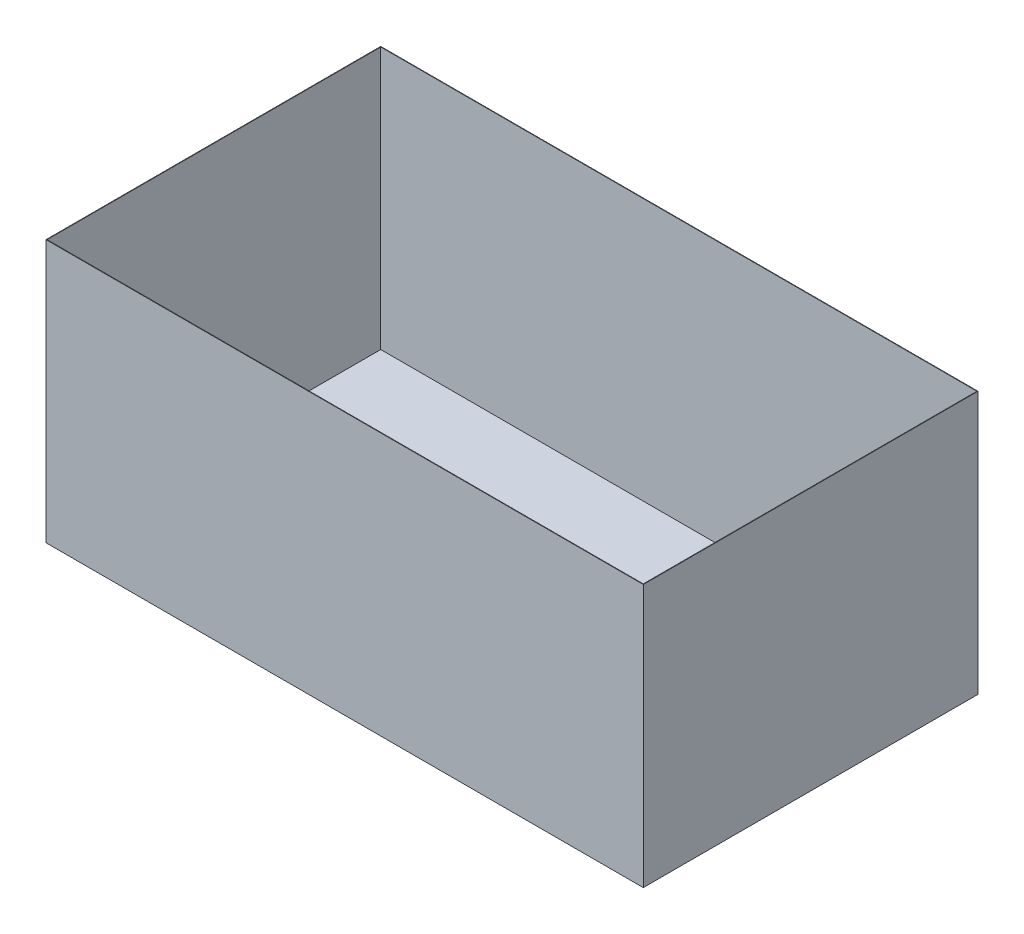
ISO-10303-21;
HEADER;
FILE_DESCRIPTION(('STEP AP214'),'2;1');
FILE_NAME('part.step','',(''),(''),'','','');
FILE_SCHEMA(('AUTOMOTIVE_DESIGN { 1 0 10303 214 1 1 1 1 }'));
ENDSEC;
DATA;
#1=APPLICATION_CONTEXT('core data for automotive mechanical design processes');
#2=APPLICATION_PROTOCOL_DEFINITION('international standard','automotive_design',2000,#1);
#3=PRODUCT_CONTEXT('',#1,'mechanical');
#4=PRODUCT('Part','Part','',(#3));
#5=PRODUCT_RELATED_PRODUCT_CATEGORY('part','',(#4));
#6=PRODUCT_DEFINITION_FORMATION('','',#4);
#7=PRODUCT_DEFINITION_CONTEXT('part definition',#1,'design');
#8=PRODUCT_DEFINITION('design','',#6,#7);
#9=PRODUCT_DEFINITION_SHAPE('','',#8);
#10=(LENGTH_UNIT() NAMED_UNIT(*) SI_UNIT(.MILLI.,.METRE.));
#11=(NAMED_UNIT(*) PLANE_ANGLE_UNIT() SI_UNIT($,.RADIAN.));
#12=(NAMED_UNIT(*) SI_UNIT($,.STERADIAN.) SOLID_ANGLE_UNIT());
#13=UNCERTAINTY_MEASURE_WITH_UNIT(LENGTH_MEASURE(1.E-05),#10,'distance_accuracy_value','');
#14=(GEOMETRIC_REPRESENTATION_CONTEXT(3) GLOBAL_UNCERTAINTY_ASSIGNED_CONTEXT((#13)) GLOBAL_UNIT_ASSIGNED_CONTEXT((#10,
#11,#12)) REPRESENTATION_CONTEXT('',''));
#15=CARTESIAN_POINT('',(0.,0.,0.));
#16=DIRECTION('',(0.,0.,1.));
#17=DIRECTION('',(1.,0.,0.));
#18=AXIS2_PLACEMENT_3D('',#15,#16,#17);
#19=CARTESIAN_POINT('',(-4091.17800000003,-556.455984062075,997.458000000037));
#20=DIRECTION('',(0.,0.,1.));
#21=DIRECTION('',(1.,0.,0.));
#22=AXIS2_PLACEMENT_3D('',#19,#20,#21);
#23=PLANE('',#22);
#24=DIRECTION('',(0.,-1.,0.));
#25=VECTOR('',#24,1.);
#26=CARTESIAN_POINT('',(1779.77799999997,-556.455984062075,997.458000000037));
#27=LINE('',#26,#25);
#28=CARTESIAN_POINT('',(1779.77799999997,2024.18401593793,997.458000000037));
#29=VERTEX_POINT('',#28);
#30=CARTESIAN_POINT('',(1779.77799999997,-556.455984062075,997.458000000037));
#31=VERTEX_POINT('',#30);
#32=EDGE_CURVE('E156',#29,#31,#27,.T.);
#33=ORIENTED_EDGE('',*,*,#32,.F.);
#34=DIRECTION('',(1.,0.,0.));
#35=VECTOR('',#34,1.);
#36=CARTESIAN_POINT('',(-4091.17800000003,2024.18401593793,997.458000000037));
#37=LINE('',#36,#35);
#38=CARTESIAN_POINT('',(-4091.17800000003,2024.18401593793,997.458000000037));
#39=VERTEX_POINT('',#38);
#40=EDGE_CURVE('E11',#39,#29,#37,.T.);
#41=ORIENTED_EDGE('',*,*,#40,.F.);
#42=DIRECTION('',(0.,-1.,0.));
#43=VECTOR('',#42,1.);
#44=CARTESIAN_POINT('',(-4091.17800000003,-556.455984062075,997.458000000037));
#45=LINE('',#44,#43);
#46=CARTESIAN_POINT('',(-4091.17800000003,-556.455984062075,997.458000000037));
#47=VERTEX_POINT('',#46);
#48=EDGE_CURVE('E162',#39,#47,#45,.T.);
#49=ORIENTED_EDGE('',*,*,#48,.T.);
#50=DIRECTION('',(1.,0.,0.));
#51=VECTOR('',#50,1.);
#52=CARTESIAN_POINT('',(-4091.17800000003,-556.455984062075,997.458000000037));
#53=LINE('',#52,#51);
#54=EDGE_CURVE('E41',#47,#31,#53,.T.);
#55=ORIENTED_EDGE('',*,*,#54,.T.);
#56=EDGE_LOOP('',(#33,#41,#49,#55));
#57=FACE_BOUND('',#56,.T.);
#58=ADVANCED_FACE('F38',(#57),#23,.T.);
#59=CARTESIAN_POINT('',(-4091.17800000003,2024.18401593793,997.458000000037));
#60=DIRECTION('',(0.,1.,0.));
#61=DIRECTION('',(0.,0.,1.));
#62=AXIS2_PLACEMENT_3D('',#59,#60,#61);
#63=PLANE('',#62);
#64=DIRECTION('',(0.,0.,1.));
#65=VECTOR('',#64,1.);
#66=CARTESIAN_POINT('',(-4086.09799725683,2024.18401593793,992.377997256838));
#67=LINE('',#66,#65);
#68=CARTESIAN_POINT('',(-4086.09799725683,2024.18401593793,-2287.77799725676));
#69=VERTEX_POINT('',#68);
#70=CARTESIAN_POINT('',(-4086.09799725683,2024.18401593793,992.377997256838));
#71=VERTEX_POINT('',#70);
#72=EDGE_CURVE('E55',#69,#71,#67,.T.);
#73=ORIENTED_EDGE('',*,*,#72,.F.);
#74=DIRECTION('',(-1.,0.,0.));
#75=VECTOR('',#74,1.);
#76=CARTESIAN_POINT('',(1774.69799725677,2024.18401593793,-2287.77799725676));
#77=LINE('',#76,#75);
#78=CARTESIAN_POINT('',(1774.69799725677,2024.18401593793,-2287.77799725676));
#79=VERTEX_POINT('',#78);
#80=EDGE_CURVE('E134',#79,#69,#77,.T.);
#81=ORIENTED_EDGE('',*,*,#80,.F.);
#82=DIRECTION('',(0.,0.,-1.));
#83=VECTOR('',#82,1.);
#84=CARTESIAN_POINT('',(1774.69799725677,2024.18401593793,992.377997256837));
#85=LINE('',#84,#83);
#86=CARTESIAN_POINT('',(1774.69799725677,2024.18401593793,992.377997256837));
#87=VERTEX_POINT('',#86);
#88=EDGE_CURVE('E138',#87,#79,#85,.T.);
#89=ORIENTED_EDGE('',*,*,#88,.F.);
#90=DIRECTION('',(1.,0.,0.));
#91=VECTOR('',#90,1.);
#92=CARTESIAN_POINT('',(1774.69799725677,2024.18401593793,992.377997256837));
#93=LINE('',#92,#91);
#94=EDGE_CURVE('E147',#71,#87,#93,.T.);
#95=ORIENTED_EDGE('',*,*,#94,.F.);
#96=EDGE_LOOP('',(#73,#81,#89,#95));
#97=FACE_BOUND('',#96,.T.);
#98=DIRECTION('',(0.,0.,1.));
#99=VECTOR('',#98,1.);
#100=CARTESIAN_POINT('',(1779.77799999997,2024.18401593793,997.458000000037));
#101=LINE('',#100,#99);
#102=CARTESIAN_POINT('',(1779.77799999997,2024.18401593793,-2292.85799999996));
#103=VERTEX_POINT('',#102);
#104=EDGE_CURVE('E166',#103,#29,#101,.T.);
#105=ORIENTED_EDGE('',*,*,#104,.F.);
#106=DIRECTION('',(1.,0.,0.));
#107=VECTOR('',#106,1.);
#108=CARTESIAN_POINT('',(-4091.17800000003,2024.18401593793,-2292.85799999996));
#109=LINE('',#108,#107);
#110=CARTESIAN_POINT('',(-4091.17800000003,2024.18401593793,-2292.85799999996));
#111=VERTEX_POINT('',#110);
#112=EDGE_CURVE('E47',#111,#103,#109,.T.);
#113=ORIENTED_EDGE('',*,*,#112,.F.);
#114=DIRECTION('',(0.,0.,1.));
#115=VECTOR('',#114,1.);
#116=CARTESIAN_POINT('',(-4091.17800000003,2024.18401593793,997.458000000037));
#117=LINE('',#116,#115);
#118=EDGE_CURVE('E173',#111,#39,#117,.T.);
#119=ORIENTED_EDGE('',*,*,#118,.T.);
#120=ORIENTED_EDGE('',*,*,#40,.T.);
#121=EDGE_LOOP('',(#105,#113,#119,#120));
#122=FACE_BOUND('',#121,.T.);
#123=ADVANCED_FACE('F198',(#97,#122),#63,.T.);
#124=CARTESIAN_POINT('',(-4091.17800000003,-556.455984062075,-2292.85799999996));
#125=DIRECTION('',(0.,0.,-1.));
#126=DIRECTION('',(-1.,0.,0.));
#127=AXIS2_PLACEMENT_3D('',#124,#125,#126);
#128=PLANE('',#127);
#129=DIRECTION('',(0.,1.,0.));
#130=VECTOR('',#129,1.);
#131=CARTESIAN_POINT('',(1779.77799999997,-556.455984062075,-2292.85799999996));
#132=LINE('',#131,#130);
#133=CARTESIAN_POINT('',(1779.77799999997,-556.455984062075,-2292.85799999996));
#134=VERTEX_POINT('',#133);
#135=EDGE_CURVE('E183',#134,#103,#132,.T.);
#136=ORIENTED_EDGE('',*,*,#135,.F.);
#137=DIRECTION('',(1.,0.,0.));
#138=VECTOR('',#137,1.);
#139=CARTESIAN_POINT('',(-4091.17800000003,-556.455984062075,-2292.85799999996));
#140=LINE('',#139,#138);
#141=CARTESIAN_POINT('',(-4091.17800000003,-556.455984062075,-2292.85799999996));
#142=VERTEX_POINT('',#141);
#143=EDGE_CURVE('E191',#142,#134,#140,.T.);
#144=ORIENTED_EDGE('',*,*,#143,.F.);
#145=DIRECTION('',(0.,1.,0.));
#146=VECTOR('',#145,1.);
#147=CARTESIAN_POINT('',(-4091.17800000003,-556.455984062075,-2292.85799999996));
#148=LINE('',#147,#146);
#149=EDGE_CURVE('E169',#142,#111,#148,.T.);
#150=ORIENTED_EDGE('',*,*,#149,.T.);
#151=ORIENTED_EDGE('',*,*,#112,.T.);
#152=EDGE_LOOP('',(#136,#144,#150,#151));
#153=FACE_BOUND('',#152,.T.);
#154=ADVANCED_FACE('F202',(#153),#128,.T.);
#155=CARTESIAN_POINT('',(-4091.17800000003,-556.455984062075,997.458000000037));
#156=DIRECTION('',(0.,-1.,0.));
#157=DIRECTION('',(0.,0.,-1.));
#158=AXIS2_PLACEMENT_3D('',#155,#156,#157);
#159=PLANE('',#158);
#160=DIRECTION('',(0.,0.,-1.));
#161=VECTOR('',#160,1.);
#162=CARTESIAN_POINT('',(1779.77799999997,-556.455984062075,997.458000000037));
#163=LINE('',#162,#161);
#164=EDGE_CURVE('E179',#31,#134,#163,.T.);
#165=ORIENTED_EDGE('',*,*,#164,.F.);
#166=ORIENTED_EDGE('',*,*,#54,.F.);
#167=DIRECTION('',(0.,0.,-1.));
#168=VECTOR('',#167,1.);
#169=CARTESIAN_POINT('',(-4091.17800000003,-556.455984062075,997.458000000037));
#170=LINE('',#169,#168);
#171=EDGE_CURVE('E165',#47,#142,#170,.T.);
#172=ORIENTED_EDGE('',*,*,#171,.T.);
#173=ORIENTED_EDGE('',*,*,#143,.T.);
#174=EDGE_LOOP('',(#165,#166,#172,#173));
#175=FACE_BOUND('',#174,.T.);
#176=ADVANCED_FACE('F195',(#175),#159,.T.);
#177=CARTESIAN_POINT('',(-4091.17800000003,-556.455984062075,997.458000000037));
#178=DIRECTION('',(-1.,0.,0.));
#179=DIRECTION('',(0.,0.,1.));
#180=AXIS2_PLACEMENT_3D('',#177,#178,#179);
#181=PLANE('',#180);
#182=ORIENTED_EDGE('',*,*,#48,.F.);
#183=ORIENTED_EDGE('',*,*,#118,.F.);
#184=ORIENTED_EDGE('',*,*,#149,.F.);
#185=ORIENTED_EDGE('',*,*,#171,.F.);
#186=EDGE_LOOP('',(#182,#183,#184,#185));
#187=FACE_BOUND('',#186,.T.);
#188=ADVANCED_FACE('F204',(#187),#181,.T.);
#189=CARTESIAN_POINT('',(1779.77799999997,-556.455984062075,997.458000000037));
#190=DIRECTION('',(-1.,0.,0.));
#191=DIRECTION('',(0.,0.,1.));
#192=AXIS2_PLACEMENT_3D('',#189,#190,#191);
#193=PLANE('',#192);
#194=ORIENTED_EDGE('',*,*,#32,.T.);
#195=ORIENTED_EDGE('',*,*,#164,.T.);
#196=ORIENTED_EDGE('',*,*,#135,.T.);
#197=ORIENTED_EDGE('',*,*,#104,.T.);
#198=EDGE_LOOP('',(#194,#195,#196,#197));
#199=FACE_BOUND('',#198,.T.);
#200=ADVANCED_FACE('F197',(#199),#193,.F.);
#201=CARTESIAN_POINT('',(-4086.09799725683,-551.375981318874,992.377997256838));
#202=DIRECTION('',(-1.,0.,0.));
#203=DIRECTION('',(0.,0.,1.));
#204=AXIS2_PLACEMENT_3D('',#201,#202,#203);
#205=PLANE('',#204);
#206=ORIENTED_EDGE('',*,*,#72,.T.);
#207=DIRECTION('',(0.,1.,0.));
#208=VECTOR('',#207,1.);
#209=CARTESIAN_POINT('',(-4086.09799725683,-551.375981318874,992.377997256838));
#210=LINE('',#209,#208);
#211=CARTESIAN_POINT('',(-4086.09799725683,-551.375981318874,992.377997256838));
#212=VERTEX_POINT('',#211);
#213=EDGE_CURVE('E109',#212,#71,#210,.T.);
#214=ORIENTED_EDGE('',*,*,#213,.F.);
#215=DIRECTION('',(0.,0.,1.));
#216=VECTOR('',#215,1.);
#217=CARTESIAN_POINT('',(-4086.09799725683,-551.375981318874,992.377997256838));
#218=LINE('',#217,#216);
#219=CARTESIAN_POINT('',(-4086.09799725683,-551.375981318874,-2287.77799725676));
#220=VERTEX_POINT('',#219);
#221=EDGE_CURVE('E113',#220,#212,#218,.T.);
#222=ORIENTED_EDGE('',*,*,#221,.F.);
#223=DIRECTION('',(0.,1.,0.));
#224=VECTOR('',#223,1.);
#225=CARTESIAN_POINT('',(-4086.09799725683,-551.375981318874,-2287.77799725676));
#226=LINE('',#225,#224);
#227=EDGE_CURVE('E153',#220,#69,#226,.T.);
#228=ORIENTED_EDGE('',*,*,#227,.T.);
#229=EDGE_LOOP('',(#206,#214,#222,#228));
#230=FACE_BOUND('',#229,.T.);
#231=ADVANCED_FACE('F111',(#230),#205,.F.);
#232=CARTESIAN_POINT('',(1774.69799725677,-551.375981318874,-2287.77799725676));
#233=DIRECTION('',(0.,0.,-1.));
#234=DIRECTION('',(-1.,0.,0.));
#235=AXIS2_PLACEMENT_3D('',#232,#233,#234);
#236=PLANE('',#235);
#237=ORIENTED_EDGE('',*,*,#80,.T.);
#238=ORIENTED_EDGE('',*,*,#227,.F.);
#239=DIRECTION('',(-1.,0.,0.));
#240=VECTOR('',#239,1.);
#241=CARTESIAN_POINT('',(1774.69799725677,-551.375981318874,-2287.77799725676));
#242=LINE('',#241,#240);
#243=CARTESIAN_POINT('',(1774.69799725677,-551.375981318874,-2287.77799725676));
#244=VERTEX_POINT('',#243);
#245=EDGE_CURVE('E120',#244,#220,#242,.T.);
#246=ORIENTED_EDGE('',*,*,#245,.F.);
#247=DIRECTION('',(0.,1.,0.));
#248=VECTOR('',#247,1.);
#249=CARTESIAN_POINT('',(1774.69799725677,-551.375981318874,-2287.77799725676));
#250=LINE('',#249,#248);
#251=EDGE_CURVE('E157',#244,#79,#250,.T.);
#252=ORIENTED_EDGE('',*,*,#251,.T.);
#253=EDGE_LOOP('',(#237,#238,#246,#252));
#254=FACE_BOUND('',#253,.T.);
#255=ADVANCED_FACE('F228',(#254),#236,.F.);
#256=CARTESIAN_POINT('',(1774.69799725677,-551.375981318874,992.377997256837));
#257=DIRECTION('',(1.,0.,0.));
#258=DIRECTION('',(0.,0.,-1.));
#259=AXIS2_PLACEMENT_3D('',#256,#257,#258);
#260=PLANE('',#259);
#261=ORIENTED_EDGE('',*,*,#88,.T.);
#262=ORIENTED_EDGE('',*,*,#251,.F.);
#263=DIRECTION('',(0.,0.,-1.));
#264=VECTOR('',#263,1.);
#265=CARTESIAN_POINT('',(1774.69799725677,-551.375981318874,992.377997256837));
#266=LINE('',#265,#264);
#267=CARTESIAN_POINT('',(1774.69799725677,-551.375981318874,992.377997256837));
#268=VERTEX_POINT('',#267);
#269=EDGE_CURVE('E129',#268,#244,#266,.T.);
#270=ORIENTED_EDGE('',*,*,#269,.F.);
#271=DIRECTION('',(0.,1.,0.));
#272=VECTOR('',#271,1.);
#273=CARTESIAN_POINT('',(1774.69799725677,-551.375981318874,992.377997256837));
#274=LINE('',#273,#272);
#275=EDGE_CURVE('E119',#268,#87,#274,.T.);
#276=ORIENTED_EDGE('',*,*,#275,.T.);
#277=EDGE_LOOP('',(#261,#262,#270,#276));
#278=FACE_BOUND('',#277,.T.);
#279=ADVANCED_FACE('F226',(#278),#260,.F.);
#280=CARTESIAN_POINT('',(1774.69799725677,-551.375981318874,992.377997256837));
#281=DIRECTION('',(0.,0.,1.));
#282=DIRECTION('',(1.,0.,0.));
#283=AXIS2_PLACEMENT_3D('',#280,#281,#282);
#284=PLANE('',#283);
#285=ORIENTED_EDGE('',*,*,#94,.T.);
#286=ORIENTED_EDGE('',*,*,#275,.F.);
#287=DIRECTION('',(1.,0.,0.));
#288=VECTOR('',#287,1.);
#289=CARTESIAN_POINT('',(1774.69799725677,-551.375981318874,992.377997256837));
#290=LINE('',#289,#288);
#291=EDGE_CURVE('E123',#212,#268,#290,.T.);
#292=ORIENTED_EDGE('',*,*,#291,.F.);
#293=ORIENTED_EDGE('',*,*,#213,.T.);
#294=EDGE_LOOP('',(#285,#286,#292,#293));
#295=FACE_BOUND('',#294,.T.);
#296=ADVANCED_FACE('F124',(#295),#284,.F.);
#297=CARTESIAN_POINT('',(1779.77799999997,-551.375981318874,997.458000000037));
#298=DIRECTION('',(0.,1.,0.));
#299=DIRECTION('',(0.,0.,1.));
#300=AXIS2_PLACEMENT_3D('',#297,#298,#299);
#301=PLANE('',#300);
#302=ORIENTED_EDGE('',*,*,#221,.T.);
#303=ORIENTED_EDGE('',*,*,#291,.T.);
#304=ORIENTED_EDGE('',*,*,#269,.T.);
#305=ORIENTED_EDGE('',*,*,#245,.T.);
#306=EDGE_LOOP('',(#302,#303,#304,#305));
#307=FACE_BOUND('',#306,.T.);
#308=ADVANCED_FACE('F131',(#307),#301,.T.);
#309=CLOSED_SHELL('',(#58,#123,#154,#176,#188,#200,#231,#255,#279,#296,#308));
#310=MANIFOLD_SOLID_BREP('B2',#309);
#311=ADVANCED_BREP_SHAPE_REPRESENTATION('',(#18,#310),#14);
#312=SHAPE_DEFINITION_REPRESENTATION(#9,#311);
ENDSEC;
END-ISO-10303-21;
